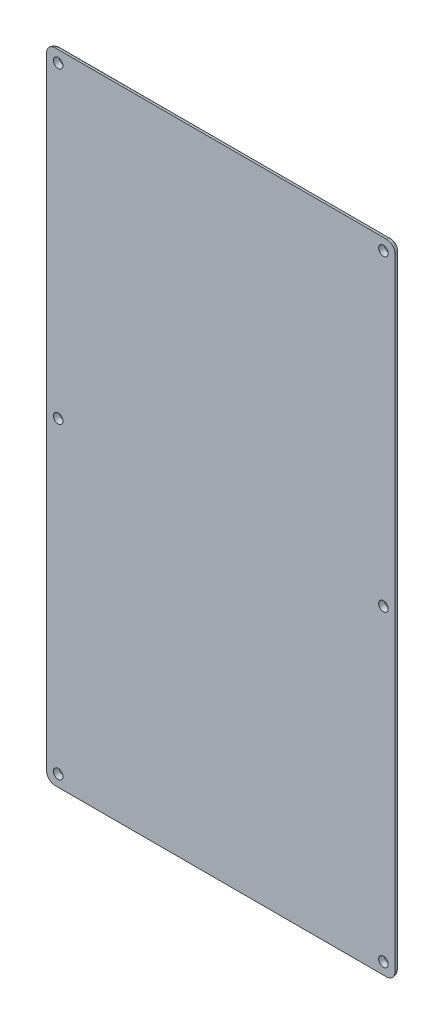
ISO-10303-21;
HEADER;
FILE_DESCRIPTION(('STEP AP214'),'2;1');
FILE_NAME('part.step','',(''),(''),'','','');
FILE_SCHEMA(('AUTOMOTIVE_DESIGN { 1 0 10303 214 1 1 1 1 }'));
ENDSEC;
DATA;
#1=APPLICATION_CONTEXT('core data for automotive mechanical design processes');
#2=APPLICATION_PROTOCOL_DEFINITION('international standard','automotive_design',2000,#1);
#3=PRODUCT_CONTEXT('',#1,'mechanical');
#4=PRODUCT('Part','Part','',(#3));
#5=PRODUCT_RELATED_PRODUCT_CATEGORY('part','',(#4));
#6=PRODUCT_DEFINITION_FORMATION('','',#4);
#7=PRODUCT_DEFINITION_CONTEXT('part definition',#1,'design');
#8=PRODUCT_DEFINITION('design','',#6,#7);
#9=PRODUCT_DEFINITION_SHAPE('','',#8);
#10=(LENGTH_UNIT() NAMED_UNIT(*) SI_UNIT(.MILLI.,.METRE.));
#11=(NAMED_UNIT(*) PLANE_ANGLE_UNIT() SI_UNIT($,.RADIAN.));
#12=(NAMED_UNIT(*) SI_UNIT($,.STERADIAN.) SOLID_ANGLE_UNIT());
#13=UNCERTAINTY_MEASURE_WITH_UNIT(LENGTH_MEASURE(1.E-05),#10,'distance_accuracy_value','');
#14=(GEOMETRIC_REPRESENTATION_CONTEXT(3) GLOBAL_UNCERTAINTY_ASSIGNED_CONTEXT((#13)) GLOBAL_UNIT_ASSIGNED_CONTEXT((#10,
#11,#12)) REPRESENTATION_CONTEXT('',''));
#15=CARTESIAN_POINT('',(0.,0.,0.));
#16=DIRECTION('',(0.,0.,1.));
#17=DIRECTION('',(1.,0.,0.));
#18=AXIS2_PLACEMENT_3D('',#15,#16,#17);
#19=CARTESIAN_POINT('',(0.,0.,2.));
#20=DIRECTION('',(0.,0.,-1.));
#21=DIRECTION('',(-1.,0.,0.));
#22=AXIS2_PLACEMENT_3D('',#19,#20,#21);
#23=PLANE('',#22);
#24=CARTESIAN_POINT('',(-56.,106.,2.));
#25=DIRECTION('',(0.,0.,1.));
#26=DIRECTION('',(1.,0.,0.));
#27=AXIS2_PLACEMENT_3D('',#24,#25,#26);
#28=CIRCLE('',#27,1.65);
#29=CARTESIAN_POINT('',(-54.35,106.,2.));
#30=VERTEX_POINT('',#29);
#31=EDGE_CURVE('E215',#30,#30,#28,.T.);
#32=ORIENTED_EDGE('',*,*,#31,.F.);
#33=EDGE_LOOP('',(#32));
#34=FACE_BOUND('',#33,.T.);
#35=CARTESIAN_POINT('',(-56.,0.,2.));
#36=DIRECTION('',(0.,0.,1.));
#37=DIRECTION('',(1.,0.,0.));
#38=AXIS2_PLACEMENT_3D('',#35,#36,#37);
#39=CIRCLE('',#38,1.65);
#40=CARTESIAN_POINT('',(-54.35,0.,2.));
#41=VERTEX_POINT('',#40);
#42=EDGE_CURVE('E223',#41,#41,#39,.T.);
#43=ORIENTED_EDGE('',*,*,#42,.F.);
#44=EDGE_LOOP('',(#43));
#45=FACE_BOUND('',#44,.T.);
#46=CARTESIAN_POINT('',(-56.,-106.,2.));
#47=DIRECTION('',(0.,0.,1.));
#48=DIRECTION('',(1.,0.,0.));
#49=AXIS2_PLACEMENT_3D('',#46,#47,#48);
#50=CIRCLE('',#49,1.65);
#51=CARTESIAN_POINT('',(-54.35,-106.,2.));
#52=VERTEX_POINT('',#51);
#53=EDGE_CURVE('E231',#52,#52,#50,.T.);
#54=ORIENTED_EDGE('',*,*,#53,.F.);
#55=EDGE_LOOP('',(#54));
#56=FACE_BOUND('',#55,.T.);
#57=CARTESIAN_POINT('',(56.,-106.,2.));
#58=DIRECTION('',(0.,0.,1.));
#59=DIRECTION('',(1.,0.,0.));
#60=AXIS2_PLACEMENT_3D('',#57,#58,#59);
#61=CIRCLE('',#60,1.65);
#62=CARTESIAN_POINT('',(57.65,-106.,2.));
#63=VERTEX_POINT('',#62);
#64=EDGE_CURVE('E208',#63,#63,#61,.T.);
#65=ORIENTED_EDGE('',*,*,#64,.F.);
#66=EDGE_LOOP('',(#65));
#67=FACE_BOUND('',#66,.T.);
#68=CARTESIAN_POINT('',(56.,0.,2.));
#69=DIRECTION('',(0.,0.,1.));
#70=DIRECTION('',(1.,0.,0.));
#71=AXIS2_PLACEMENT_3D('',#68,#69,#70);
#72=CIRCLE('',#71,1.65);
#73=CARTESIAN_POINT('',(57.65,0.,2.));
#74=VERTEX_POINT('',#73);
#75=EDGE_CURVE('E195',#74,#74,#72,.T.);
#76=ORIENTED_EDGE('',*,*,#75,.F.);
#77=EDGE_LOOP('',(#76));
#78=FACE_BOUND('',#77,.T.);
#79=CARTESIAN_POINT('',(56.,106.,2.));
#80=DIRECTION('',(0.,0.,1.));
#81=DIRECTION('',(1.,0.,0.));
#82=AXIS2_PLACEMENT_3D('',#79,#80,#81);
#83=CIRCLE('',#82,1.65);
#84=CARTESIAN_POINT('',(57.65,106.,2.));
#85=VERTEX_POINT('',#84);
#86=EDGE_CURVE('E139',#85,#85,#83,.T.);
#87=ORIENTED_EDGE('',*,*,#86,.F.);
#88=EDGE_LOOP('',(#87));
#89=FACE_BOUND('',#88,.T.);
#90=DIRECTION('',(1.,0.,0.));
#91=VECTOR('',#90,1.);
#92=CARTESIAN_POINT('',(-60.,-110.,2.));
#93=LINE('',#92,#91);
#94=CARTESIAN_POINT('',(-57.,-110.,2.));
#95=VERTEX_POINT('',#94);
#96=CARTESIAN_POINT('',(57.,-110.,2.));
#97=VERTEX_POINT('',#96);
#98=EDGE_CURVE('E110',#95,#97,#93,.T.);
#99=ORIENTED_EDGE('',*,*,#98,.T.);
#100=CARTESIAN_POINT('',(57.,-107.,2.));
#101=DIRECTION('',(0.,0.,-1.));
#102=DIRECTION('',(-1.,0.,0.));
#103=AXIS2_PLACEMENT_3D('',#100,#101,#102);
#104=CIRCLE('',#103,3.);
#105=CARTESIAN_POINT('',(60.,-107.,2.));
#106=VERTEX_POINT('',#105);
#107=EDGE_CURVE('E103',#97,#106,#104,.F.);
#108=ORIENTED_EDGE('',*,*,#107,.T.);
#109=DIRECTION('',(0.,1.,0.));
#110=VECTOR('',#109,1.);
#111=CARTESIAN_POINT('',(60.,-110.,2.));
#112=LINE('',#111,#110);
#113=CARTESIAN_POINT('',(60.,107.,2.));
#114=VERTEX_POINT('',#113);
#115=EDGE_CURVE('E107',#106,#114,#112,.T.);
#116=ORIENTED_EDGE('',*,*,#115,.T.);
#117=CARTESIAN_POINT('',(57.,107.,2.));
#118=DIRECTION('',(0.,0.,-1.));
#119=DIRECTION('',(-1.,0.,0.));
#120=AXIS2_PLACEMENT_3D('',#117,#118,#119);
#121=CIRCLE('',#120,3.);
#122=CARTESIAN_POINT('',(57.,110.,2.));
#123=VERTEX_POINT('',#122);
#124=EDGE_CURVE('E147',#114,#123,#121,.F.);
#125=ORIENTED_EDGE('',*,*,#124,.T.);
#126=DIRECTION('',(-1.,0.,0.));
#127=VECTOR('',#126,1.);
#128=CARTESIAN_POINT('',(-60.,110.,2.));
#129=LINE('',#128,#127);
#130=CARTESIAN_POINT('',(-57.,110.,2.));
#131=VERTEX_POINT('',#130);
#132=EDGE_CURVE('E131',#123,#131,#129,.T.);
#133=ORIENTED_EDGE('',*,*,#132,.T.);
#134=CARTESIAN_POINT('',(-57.,107.,2.));
#135=DIRECTION('',(0.,0.,-1.));
#136=DIRECTION('',(-1.,0.,0.));
#137=AXIS2_PLACEMENT_3D('',#134,#135,#136);
#138=CIRCLE('',#137,3.);
#139=CARTESIAN_POINT('',(-60.,107.,2.));
#140=VERTEX_POINT('',#139);
#141=EDGE_CURVE('E150',#131,#140,#138,.F.);
#142=ORIENTED_EDGE('',*,*,#141,.T.);
#143=DIRECTION('',(0.,-1.,0.));
#144=VECTOR('',#143,1.);
#145=CARTESIAN_POINT('',(-60.,-110.,2.));
#146=LINE('',#145,#144);
#147=CARTESIAN_POINT('',(-60.,-107.,2.));
#148=VERTEX_POINT('',#147);
#149=EDGE_CURVE('E136',#140,#148,#146,.T.);
#150=ORIENTED_EDGE('',*,*,#149,.T.);
#151=CARTESIAN_POINT('',(-57.,-107.,2.));
#152=DIRECTION('',(0.,0.,-1.));
#153=DIRECTION('',(-1.,0.,0.));
#154=AXIS2_PLACEMENT_3D('',#151,#152,#153);
#155=CIRCLE('',#154,3.);
#156=EDGE_CURVE('E116',#148,#95,#155,.F.);
#157=ORIENTED_EDGE('',*,*,#156,.T.);
#158=EDGE_LOOP('',(#99,#108,#116,#125,#133,#142,#150,#157));
#159=FACE_BOUND('',#158,.T.);
#160=ADVANCED_FACE('F41',(#34,#45,#56,#67,#78,#89,#159),#23,.F.);
#161=CARTESIAN_POINT('',(0.,0.,0.));
#162=DIRECTION('',(0.,0.,-1.));
#163=DIRECTION('',(-1.,0.,0.));
#164=AXIS2_PLACEMENT_3D('',#161,#162,#163);
#165=PLANE('',#164);
#166=CARTESIAN_POINT('',(57.,-107.,0.));
#167=DIRECTION('',(0.,0.,-1.));
#168=DIRECTION('',(-1.,0.,0.));
#169=AXIS2_PLACEMENT_3D('',#166,#167,#168);
#170=CIRCLE('',#169,1.);
#171=CARTESIAN_POINT('',(58.,-107.,0.));
#172=VERTEX_POINT('',#171);
#173=CARTESIAN_POINT('',(57.,-108.,0.));
#174=VERTEX_POINT('',#173);
#175=EDGE_CURVE('E51',#172,#174,#170,.T.);
#176=ORIENTED_EDGE('',*,*,#175,.T.);
#177=DIRECTION('',(1.,0.,0.));
#178=VECTOR('',#177,1.);
#179=CARTESIAN_POINT('',(-57.,-108.,0.));
#180=LINE('',#179,#178);
#181=CARTESIAN_POINT('',(-57.,-108.,0.));
#182=VERTEX_POINT('',#181);
#183=EDGE_CURVE('E11',#174,#182,#180,.F.);
#184=ORIENTED_EDGE('',*,*,#183,.T.);
#185=CARTESIAN_POINT('',(-57.,-107.,0.));
#186=DIRECTION('',(0.,0.,-1.));
#187=DIRECTION('',(-1.,0.,0.));
#188=AXIS2_PLACEMENT_3D('',#185,#186,#187);
#189=CIRCLE('',#188,1.);
#190=CARTESIAN_POINT('',(-58.,-107.,0.));
#191=VERTEX_POINT('',#190);
#192=EDGE_CURVE('E170',#182,#191,#189,.T.);
#193=ORIENTED_EDGE('',*,*,#192,.T.);
#194=DIRECTION('',(0.,-1.,0.));
#195=VECTOR('',#194,1.);
#196=CARTESIAN_POINT('',(-58.,107.,0.));
#197=LINE('',#196,#195);
#198=CARTESIAN_POINT('',(-58.,107.,0.));
#199=VERTEX_POINT('',#198);
#200=EDGE_CURVE('E167',#191,#199,#197,.F.);
#201=ORIENTED_EDGE('',*,*,#200,.T.);
#202=CARTESIAN_POINT('',(-57.,107.,0.));
#203=DIRECTION('',(0.,0.,-1.));
#204=DIRECTION('',(-1.,0.,0.));
#205=AXIS2_PLACEMENT_3D('',#202,#203,#204);
#206=CIRCLE('',#205,1.);
#207=CARTESIAN_POINT('',(-57.,108.,0.));
#208=VERTEX_POINT('',#207);
#209=EDGE_CURVE('E157',#199,#208,#206,.T.);
#210=ORIENTED_EDGE('',*,*,#209,.T.);
#211=DIRECTION('',(-1.,0.,0.));
#212=VECTOR('',#211,1.);
#213=CARTESIAN_POINT('',(57.,108.,0.));
#214=LINE('',#213,#212);
#215=CARTESIAN_POINT('',(57.,108.,0.));
#216=VERTEX_POINT('',#215);
#217=EDGE_CURVE('E115',#208,#216,#214,.F.);
#218=ORIENTED_EDGE('',*,*,#217,.T.);
#219=CARTESIAN_POINT('',(57.,107.,0.));
#220=DIRECTION('',(0.,0.,-1.));
#221=DIRECTION('',(-1.,0.,0.));
#222=AXIS2_PLACEMENT_3D('',#219,#220,#221);
#223=CIRCLE('',#222,1.);
#224=CARTESIAN_POINT('',(58.,107.,0.));
#225=VERTEX_POINT('',#224);
#226=EDGE_CURVE('E160',#216,#225,#223,.T.);
#227=ORIENTED_EDGE('',*,*,#226,.T.);
#228=DIRECTION('',(0.,1.,0.));
#229=VECTOR('',#228,1.);
#230=CARTESIAN_POINT('',(58.,-107.,0.));
#231=LINE('',#230,#229);
#232=EDGE_CURVE('E164',#225,#172,#231,.F.);
#233=ORIENTED_EDGE('',*,*,#232,.T.);
#234=EDGE_LOOP('',(#176,#184,#193,#201,#210,#218,#227,#233));
#235=FACE_BOUND('',#234,.T.);
#236=CARTESIAN_POINT('',(-56.,106.,0.));
#237=DIRECTION('',(0.,0.,1.));
#238=DIRECTION('',(1.,0.,0.));
#239=AXIS2_PLACEMENT_3D('',#236,#237,#238);
#240=CIRCLE('',#239,1.65);
#241=CARTESIAN_POINT('',(-54.35,106.,0.));
#242=VERTEX_POINT('',#241);
#243=EDGE_CURVE('E211',#242,#242,#240,.T.);
#244=ORIENTED_EDGE('',*,*,#243,.T.);
#245=EDGE_LOOP('',(#244));
#246=FACE_BOUND('',#245,.T.);
#247=CARTESIAN_POINT('',(-56.,0.,0.));
#248=DIRECTION('',(0.,0.,1.));
#249=DIRECTION('',(1.,0.,0.));
#250=AXIS2_PLACEMENT_3D('',#247,#248,#249);
#251=CIRCLE('',#250,1.65);
#252=CARTESIAN_POINT('',(-54.35,0.,0.));
#253=VERTEX_POINT('',#252);
#254=EDGE_CURVE('E219',#253,#253,#251,.T.);
#255=ORIENTED_EDGE('',*,*,#254,.T.);
#256=EDGE_LOOP('',(#255));
#257=FACE_BOUND('',#256,.T.);
#258=CARTESIAN_POINT('',(-56.,-106.,0.));
#259=DIRECTION('',(0.,0.,1.));
#260=DIRECTION('',(1.,0.,0.));
#261=AXIS2_PLACEMENT_3D('',#258,#259,#260);
#262=CIRCLE('',#261,1.65);
#263=CARTESIAN_POINT('',(-54.35,-106.,0.));
#264=VERTEX_POINT('',#263);
#265=EDGE_CURVE('E227',#264,#264,#262,.T.);
#266=ORIENTED_EDGE('',*,*,#265,.T.);
#267=EDGE_LOOP('',(#266));
#268=FACE_BOUND('',#267,.T.);
#269=CARTESIAN_POINT('',(56.,-106.,0.));
#270=DIRECTION('',(0.,0.,1.));
#271=DIRECTION('',(1.,0.,0.));
#272=AXIS2_PLACEMENT_3D('',#269,#270,#271);
#273=CIRCLE('',#272,1.65);
#274=CARTESIAN_POINT('',(57.65,-106.,0.));
#275=VERTEX_POINT('',#274);
#276=EDGE_CURVE('E235',#275,#275,#273,.T.);
#277=ORIENTED_EDGE('',*,*,#276,.T.);
#278=EDGE_LOOP('',(#277));
#279=FACE_BOUND('',#278,.T.);
#280=CARTESIAN_POINT('',(56.,0.,0.));
#281=DIRECTION('',(0.,0.,1.));
#282=DIRECTION('',(1.,0.,0.));
#283=AXIS2_PLACEMENT_3D('',#280,#281,#282);
#284=CIRCLE('',#283,1.65);
#285=CARTESIAN_POINT('',(57.65,0.,0.));
#286=VERTEX_POINT('',#285);
#287=EDGE_CURVE('E202',#286,#286,#284,.T.);
#288=ORIENTED_EDGE('',*,*,#287,.T.);
#289=EDGE_LOOP('',(#288));
#290=FACE_BOUND('',#289,.T.);
#291=CARTESIAN_POINT('',(56.,106.,0.));
#292=DIRECTION('',(0.,0.,1.));
#293=DIRECTION('',(1.,0.,0.));
#294=AXIS2_PLACEMENT_3D('',#291,#292,#293);
#295=CIRCLE('',#294,1.65);
#296=CARTESIAN_POINT('',(57.65,106.,0.));
#297=VERTEX_POINT('',#296);
#298=EDGE_CURVE('E132',#297,#297,#295,.T.);
#299=ORIENTED_EDGE('',*,*,#298,.T.);
#300=EDGE_LOOP('',(#299));
#301=FACE_BOUND('',#300,.T.);
#302=ADVANCED_FACE('F247',(#235,#246,#257,#268,#279,#290,#301),#165,.T.);
#303=CARTESIAN_POINT('',(56.,106.,0.));
#304=DIRECTION('',(0.,0.,1.));
#305=DIRECTION('',(1.,0.,0.));
#306=AXIS2_PLACEMENT_3D('',#303,#304,#305);
#307=CYLINDRICAL_SURFACE('',#306,1.65);
#308=ORIENTED_EDGE('',*,*,#298,.F.);
#309=EDGE_LOOP('',(#308));
#310=FACE_BOUND('',#309,.T.);
#311=ORIENTED_EDGE('',*,*,#86,.T.);
#312=EDGE_LOOP('',(#311));
#313=FACE_BOUND('',#312,.T.);
#314=ADVANCED_FACE('F255',(#310,#313),#307,.F.);
#315=CARTESIAN_POINT('',(56.,0.,0.));
#316=DIRECTION('',(0.,0.,1.));
#317=DIRECTION('',(1.,0.,0.));
#318=AXIS2_PLACEMENT_3D('',#315,#316,#317);
#319=CYLINDRICAL_SURFACE('',#318,1.65);
#320=ORIENTED_EDGE('',*,*,#287,.F.);
#321=EDGE_LOOP('',(#320));
#322=FACE_BOUND('',#321,.T.);
#323=ORIENTED_EDGE('',*,*,#75,.T.);
#324=EDGE_LOOP('',(#323));
#325=FACE_BOUND('',#324,.T.);
#326=ADVANCED_FACE('F257',(#322,#325),#319,.F.);
#327=CARTESIAN_POINT('',(56.,-106.,0.));
#328=DIRECTION('',(0.,0.,1.));
#329=DIRECTION('',(1.,0.,0.));
#330=AXIS2_PLACEMENT_3D('',#327,#328,#329);
#331=CYLINDRICAL_SURFACE('',#330,1.65);
#332=ORIENTED_EDGE('',*,*,#276,.F.);
#333=EDGE_LOOP('',(#332));
#334=FACE_BOUND('',#333,.T.);
#335=ORIENTED_EDGE('',*,*,#64,.T.);
#336=EDGE_LOOP('',(#335));
#337=FACE_BOUND('',#336,.T.);
#338=ADVANCED_FACE('F243',(#334,#337),#331,.F.);
#339=CARTESIAN_POINT('',(-56.,-106.,0.));
#340=DIRECTION('',(0.,0.,1.));
#341=DIRECTION('',(1.,0.,0.));
#342=AXIS2_PLACEMENT_3D('',#339,#340,#341);
#343=CYLINDRICAL_SURFACE('',#342,1.65);
#344=ORIENTED_EDGE('',*,*,#265,.F.);
#345=EDGE_LOOP('',(#344));
#346=FACE_BOUND('',#345,.T.);
#347=ORIENTED_EDGE('',*,*,#53,.T.);
#348=EDGE_LOOP('',(#347));
#349=FACE_BOUND('',#348,.T.);
#350=ADVANCED_FACE('F324',(#346,#349),#343,.F.);
#351=CARTESIAN_POINT('',(-56.,0.,0.));
#352=DIRECTION('',(0.,0.,1.));
#353=DIRECTION('',(1.,0.,0.));
#354=AXIS2_PLACEMENT_3D('',#351,#352,#353);
#355=CYLINDRICAL_SURFACE('',#354,1.65);
#356=ORIENTED_EDGE('',*,*,#254,.F.);
#357=EDGE_LOOP('',(#356));
#358=FACE_BOUND('',#357,.T.);
#359=ORIENTED_EDGE('',*,*,#42,.T.);
#360=EDGE_LOOP('',(#359));
#361=FACE_BOUND('',#360,.T.);
#362=ADVANCED_FACE('F299',(#358,#361),#355,.F.);
#363=CARTESIAN_POINT('',(-56.,106.,0.));
#364=DIRECTION('',(0.,0.,1.));
#365=DIRECTION('',(1.,0.,0.));
#366=AXIS2_PLACEMENT_3D('',#363,#364,#365);
#367=CYLINDRICAL_SURFACE('',#366,1.65);
#368=ORIENTED_EDGE('',*,*,#243,.F.);
#369=EDGE_LOOP('',(#368));
#370=FACE_BOUND('',#369,.T.);
#371=ORIENTED_EDGE('',*,*,#31,.T.);
#372=EDGE_LOOP('',(#371));
#373=FACE_BOUND('',#372,.T.);
#374=ADVANCED_FACE('F294',(#370,#373),#367,.F.);
#375=CARTESIAN_POINT('',(-57.,-107.,2.));
#376=DIRECTION('',(0.,0.,-1.));
#377=DIRECTION('',(-1.,0.,0.));
#378=AXIS2_PLACEMENT_3D('',#375,#376,#377);
#379=DEGENERATE_TOROIDAL_SURFACE('',#378,1.,2.,.T.);
#380=CARTESIAN_POINT('',(-57.,-108.,2.));
#381=DIRECTION('',(1.,0.,0.));
#382=DIRECTION('',(0.,0.,-1.));
#383=AXIS2_PLACEMENT_3D('',#380,#381,#382);
#384=CIRCLE('',#383,2.);
#385=EDGE_CURVE('E188',#95,#182,#384,.T.);
#386=ORIENTED_EDGE('',*,*,#385,.F.);
#387=ORIENTED_EDGE('',*,*,#156,.F.);
#388=CARTESIAN_POINT('',(-58.,-107.,2.));
#389=DIRECTION('',(0.,1.,0.));
#390=DIRECTION('',(0.,0.,1.));
#391=AXIS2_PLACEMENT_3D('',#388,#389,#390);
#392=CIRCLE('',#391,2.);
#393=EDGE_CURVE('E45',#191,#148,#392,.T.);
#394=ORIENTED_EDGE('',*,*,#393,.F.);
#395=ORIENTED_EDGE('',*,*,#192,.F.);
#396=EDGE_LOOP('',(#386,#387,#394,#395));
#397=FACE_BOUND('',#396,.T.);
#398=ADVANCED_FACE('F43',(#397),#379,.T.);
#399=CARTESIAN_POINT('',(-58.,-110.,2.));
#400=DIRECTION('',(0.,1.,0.));
#401=DIRECTION('',(0.,0.,1.));
#402=AXIS2_PLACEMENT_3D('',#399,#400,#401);
#403=CYLINDRICAL_SURFACE('',#402,2.);
#404=ORIENTED_EDGE('',*,*,#393,.T.);
#405=ORIENTED_EDGE('',*,*,#149,.F.);
#406=CARTESIAN_POINT('',(-58.,107.,2.));
#407=DIRECTION('',(0.,1.,0.));
#408=DIRECTION('',(0.,0.,1.));
#409=AXIS2_PLACEMENT_3D('',#406,#407,#408);
#410=CIRCLE('',#409,2.);
#411=EDGE_CURVE('E185',#199,#140,#410,.T.);
#412=ORIENTED_EDGE('',*,*,#411,.F.);
#413=ORIENTED_EDGE('',*,*,#200,.F.);
#414=EDGE_LOOP('',(#404,#405,#412,#413));
#415=FACE_BOUND('',#414,.T.);
#416=ADVANCED_FACE('F289',(#415),#403,.T.);
#417=CARTESIAN_POINT('',(-60.,-108.,2.));
#418=DIRECTION('',(-1.,0.,0.));
#419=DIRECTION('',(0.,0.,1.));
#420=AXIS2_PLACEMENT_3D('',#417,#418,#419);
#421=CYLINDRICAL_SURFACE('',#420,2.);
#422=ORIENTED_EDGE('',*,*,#385,.T.);
#423=ORIENTED_EDGE('',*,*,#183,.F.);
#424=CARTESIAN_POINT('',(57.,-108.,2.));
#425=DIRECTION('',(1.,0.,0.));
#426=DIRECTION('',(0.,0.,-1.));
#427=AXIS2_PLACEMENT_3D('',#424,#425,#426);
#428=CIRCLE('',#427,2.);
#429=EDGE_CURVE('E182',#97,#174,#428,.T.);
#430=ORIENTED_EDGE('',*,*,#429,.F.);
#431=ORIENTED_EDGE('',*,*,#98,.F.);
#432=EDGE_LOOP('',(#422,#423,#430,#431));
#433=FACE_BOUND('',#432,.T.);
#434=ADVANCED_FACE('F286',(#433),#421,.T.);
#435=CARTESIAN_POINT('',(-57.,107.,2.));
#436=DIRECTION('',(0.,0.,-1.));
#437=DIRECTION('',(-1.,0.,0.));
#438=AXIS2_PLACEMENT_3D('',#435,#436,#437);
#439=DEGENERATE_TOROIDAL_SURFACE('',#438,1.,2.,.T.);
#440=ORIENTED_EDGE('',*,*,#411,.T.);
#441=ORIENTED_EDGE('',*,*,#141,.F.);
#442=CARTESIAN_POINT('',(-57.,108.,2.));
#443=DIRECTION('',(1.,0.,0.));
#444=DIRECTION('',(0.,0.,-1.));
#445=AXIS2_PLACEMENT_3D('',#442,#443,#444);
#446=CIRCLE('',#445,2.);
#447=EDGE_CURVE('E124',#208,#131,#446,.T.);
#448=ORIENTED_EDGE('',*,*,#447,.F.);
#449=ORIENTED_EDGE('',*,*,#209,.F.);
#450=EDGE_LOOP('',(#440,#441,#448,#449));
#451=FACE_BOUND('',#450,.T.);
#452=ADVANCED_FACE('F283',(#451),#439,.T.);
#453=CARTESIAN_POINT('',(57.,-107.,2.));
#454=DIRECTION('',(0.,0.,-1.));
#455=DIRECTION('',(-1.,0.,0.));
#456=AXIS2_PLACEMENT_3D('',#453,#454,#455);
#457=DEGENERATE_TOROIDAL_SURFACE('',#456,1.,2.,.T.);
#458=ORIENTED_EDGE('',*,*,#429,.T.);
#459=ORIENTED_EDGE('',*,*,#175,.F.);
#460=CARTESIAN_POINT('',(58.,-107.,2.));
#461=DIRECTION('',(0.,1.,0.));
#462=DIRECTION('',(0.,0.,1.));
#463=AXIS2_PLACEMENT_3D('',#460,#461,#462);
#464=CIRCLE('',#463,2.);
#465=EDGE_CURVE('E119',#106,#172,#464,.T.);
#466=ORIENTED_EDGE('',*,*,#465,.F.);
#467=ORIENTED_EDGE('',*,*,#107,.F.);
#468=EDGE_LOOP('',(#458,#459,#466,#467));
#469=FACE_BOUND('',#468,.T.);
#470=ADVANCED_FACE('F120',(#469),#457,.T.);
#471=CARTESIAN_POINT('',(-60.,108.,2.));
#472=DIRECTION('',(1.,0.,0.));
#473=DIRECTION('',(0.,0.,-1.));
#474=AXIS2_PLACEMENT_3D('',#471,#472,#473);
#475=CYLINDRICAL_SURFACE('',#474,2.);
#476=ORIENTED_EDGE('',*,*,#447,.T.);
#477=ORIENTED_EDGE('',*,*,#132,.F.);
#478=CARTESIAN_POINT('',(57.,108.,2.));
#479=DIRECTION('',(1.,0.,0.));
#480=DIRECTION('',(0.,0.,-1.));
#481=AXIS2_PLACEMENT_3D('',#478,#479,#480);
#482=CIRCLE('',#481,2.);
#483=EDGE_CURVE('E125',#216,#123,#482,.T.);
#484=ORIENTED_EDGE('',*,*,#483,.F.);
#485=ORIENTED_EDGE('',*,*,#217,.F.);
#486=EDGE_LOOP('',(#476,#477,#484,#485));
#487=FACE_BOUND('',#486,.T.);
#488=ADVANCED_FACE('F277',(#487),#475,.T.);
#489=CARTESIAN_POINT('',(58.,-110.,2.));
#490=DIRECTION('',(0.,-1.,0.));
#491=DIRECTION('',(0.,0.,-1.));
#492=AXIS2_PLACEMENT_3D('',#489,#490,#491);
#493=CYLINDRICAL_SURFACE('',#492,2.);
#494=ORIENTED_EDGE('',*,*,#465,.T.);
#495=ORIENTED_EDGE('',*,*,#232,.F.);
#496=CARTESIAN_POINT('',(58.,107.,2.));
#497=DIRECTION('',(0.,1.,0.));
#498=DIRECTION('',(0.,0.,1.));
#499=AXIS2_PLACEMENT_3D('',#496,#497,#498);
#500=CIRCLE('',#499,2.);
#501=EDGE_CURVE('E129',#114,#225,#500,.T.);
#502=ORIENTED_EDGE('',*,*,#501,.F.);
#503=ORIENTED_EDGE('',*,*,#115,.F.);
#504=EDGE_LOOP('',(#494,#495,#502,#503));
#505=FACE_BOUND('',#504,.T.);
#506=ADVANCED_FACE('F128',(#505),#493,.T.);
#507=CARTESIAN_POINT('',(57.,107.,2.));
#508=DIRECTION('',(0.,0.,-1.));
#509=DIRECTION('',(-1.,0.,0.));
#510=AXIS2_PLACEMENT_3D('',#507,#508,#509);
#511=DEGENERATE_TOROIDAL_SURFACE('',#510,1.,2.,.T.);
#512=ORIENTED_EDGE('',*,*,#483,.T.);
#513=ORIENTED_EDGE('',*,*,#124,.F.);
#514=ORIENTED_EDGE('',*,*,#501,.T.);
#515=ORIENTED_EDGE('',*,*,#226,.F.);
#516=EDGE_LOOP('',(#512,#513,#514,#515));
#517=FACE_BOUND('',#516,.T.);
#518=ADVANCED_FACE('F271',(#517),#511,.T.);
#519=CLOSED_SHELL('',(#160,#302,#314,#326,#338,#350,#362,#374,#398,#416,#434,#452,#470,#488,
#506,#518));
#520=MANIFOLD_SOLID_BREP('B2',#519);
#521=ADVANCED_BREP_SHAPE_REPRESENTATION('',(#18,#520),#14);
#522=SHAPE_DEFINITION_REPRESENTATION(#9,#521);
ENDSEC;
END-ISO-10303-21;
